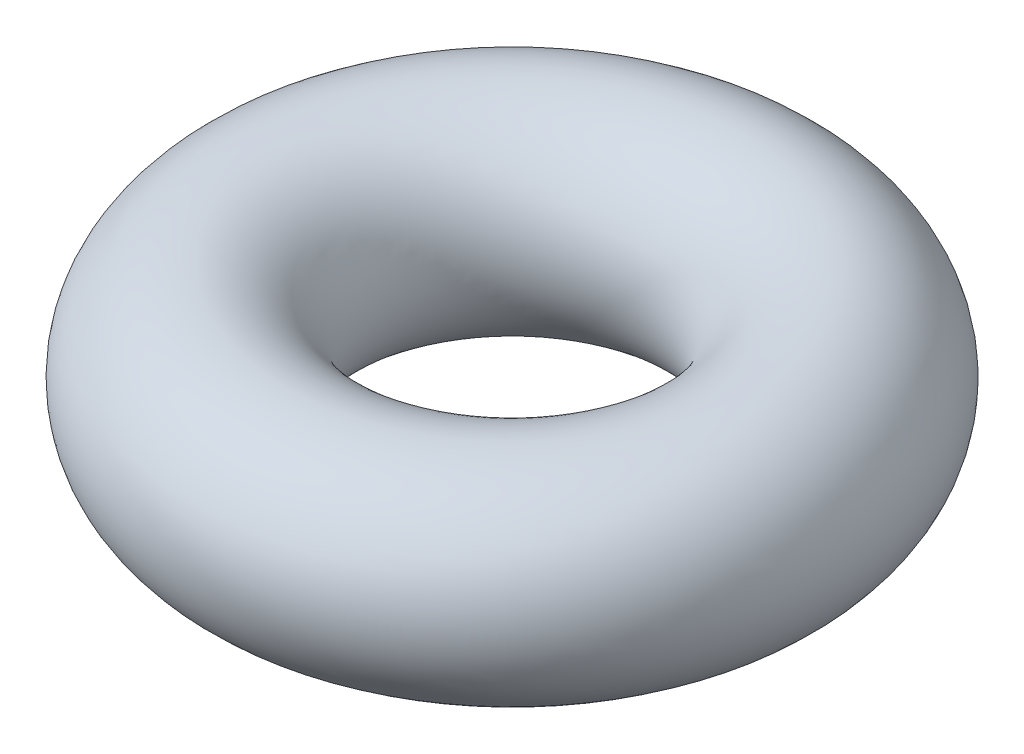
ISO-10303-21;
HEADER;
FILE_DESCRIPTION(('STEP AP214'),'2;1');
FILE_NAME('part.step','',(''),(''),'','','');
FILE_SCHEMA(('AUTOMOTIVE_DESIGN { 1 0 10303 214 1 1 1 1 }'));
ENDSEC;
DATA;
#1=APPLICATION_CONTEXT('core data for automotive mechanical design processes');
#2=APPLICATION_PROTOCOL_DEFINITION('international standard','automotive_design',2000,#1);
#3=PRODUCT_CONTEXT('',#1,'mechanical');
#4=PRODUCT('Part','Part','',(#3));
#5=PRODUCT_RELATED_PRODUCT_CATEGORY('part','',(#4));
#6=PRODUCT_DEFINITION_FORMATION('','',#4);
#7=PRODUCT_DEFINITION_CONTEXT('part definition',#1,'design');
#8=PRODUCT_DEFINITION('design','',#6,#7);
#9=PRODUCT_DEFINITION_SHAPE('','',#8);
#10=(LENGTH_UNIT() NAMED_UNIT(*) SI_UNIT(.MILLI.,.METRE.));
#11=(NAMED_UNIT(*) PLANE_ANGLE_UNIT() SI_UNIT($,.RADIAN.));
#12=(NAMED_UNIT(*) SI_UNIT($,.STERADIAN.) SOLID_ANGLE_UNIT());
#13=UNCERTAINTY_MEASURE_WITH_UNIT(LENGTH_MEASURE(1.E-05),#10,'distance_accuracy_value','');
#14=(GEOMETRIC_REPRESENTATION_CONTEXT(3) GLOBAL_UNCERTAINTY_ASSIGNED_CONTEXT((#13)) GLOBAL_UNIT_ASSIGNED_CONTEXT((#10,
#11,#12)) REPRESENTATION_CONTEXT('',''));
#15=CARTESIAN_POINT('',(0.,0.,0.));
#16=DIRECTION('',(0.,0.,1.));
#17=DIRECTION('',(1.,0.,0.));
#18=AXIS2_PLACEMENT_3D('',#15,#16,#17);
#19=CARTESIAN_POINT('',(0.,0.,0.));
#20=DIRECTION('',(0.,1.,0.));
#21=DIRECTION('',(0.,0.,1.));
#22=AXIS2_PLACEMENT_3D('',#19,#20,#21);
#23=TOROIDAL_SURFACE('',#22,2.,0.9);
#24=CARTESIAN_POINT('',(-2.,0.,0.));
#25=DIRECTION('',(0.,0.,1.));
#26=DIRECTION('',(1.,0.,0.));
#27=AXIS2_PLACEMENT_3D('',#24,#25,#26);
#28=CIRCLE('',#27,0.9);
#29=CARTESIAN_POINT('',(-2.9,0.,0.));
#30=VERTEX_POINT('',#29);
#31=EDGE_CURVE('E10',#30,#30,#28,.T.);
#32=CARTESIAN_POINT('',(0.,0.,0.));
#33=DIRECTION('',(0.,1.,0.));
#34=DIRECTION('',(0.,0.,1.));
#35=AXIS2_PLACEMENT_3D('',#32,#33,#34);
#36=CIRCLE('',#35,2.9);
#37=EDGE_CURVE('',#30,#30,#36,.T.);
#38=ORIENTED_EDGE('',*,*,#31,.T.);
#39=ORIENTED_EDGE('',*,*,#31,.F.);
#40=ORIENTED_EDGE('',*,*,#37,.T.);
#41=ORIENTED_EDGE('',*,*,#37,.F.);
#42=EDGE_LOOP('',(#38,#40,#39,#41));
#43=FACE_BOUND('',#42,.T.);
#44=ADVANCED_FACE('F31',(#43),#23,.T.);
#45=CLOSED_SHELL('',(#44));
#46=MANIFOLD_SOLID_BREP('B2',#45);
#47=ADVANCED_BREP_SHAPE_REPRESENTATION('',(#18,#46),#14);
#48=SHAPE_DEFINITION_REPRESENTATION(#9,#47);
ENDSEC;
END-ISO-10303-21;
